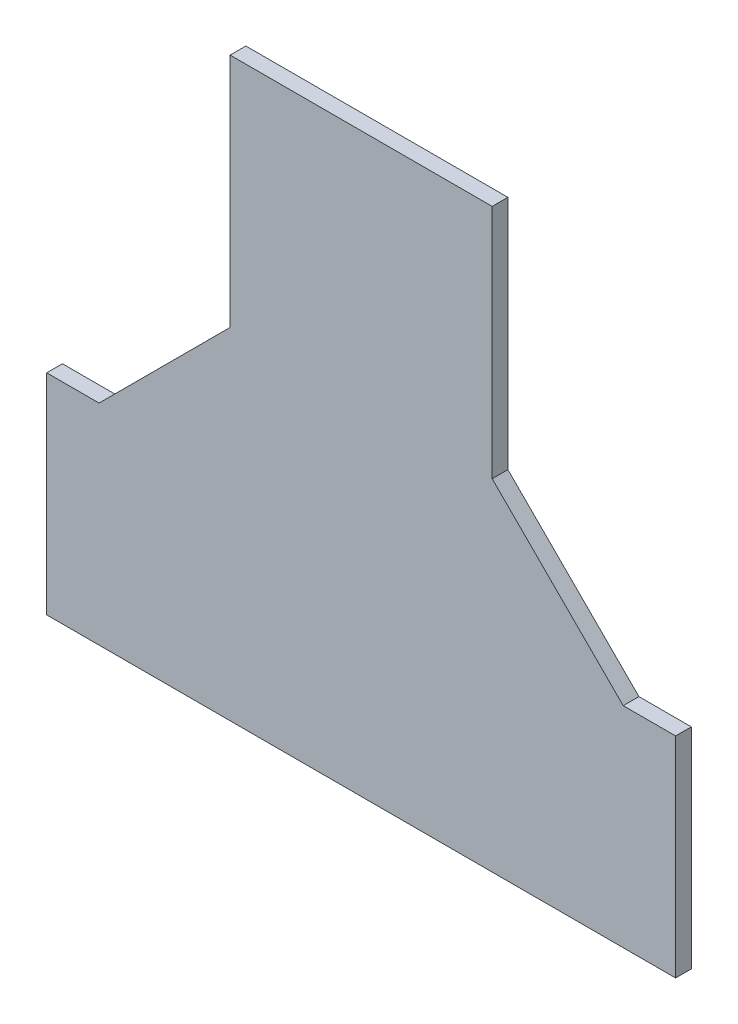
ISO-10303-21;
HEADER;
FILE_DESCRIPTION(('STEP AP214'),'2;1');
FILE_NAME('part.step','',(''),(''),'','','');
FILE_SCHEMA(('AUTOMOTIVE_DESIGN { 1 0 10303 214 1 1 1 1 }'));
ENDSEC;
DATA;
#1=APPLICATION_CONTEXT('core data for automotive mechanical design processes');
#2=APPLICATION_PROTOCOL_DEFINITION('international standard','automotive_design',2000,#1);
#3=PRODUCT_CONTEXT('',#1,'mechanical');
#4=PRODUCT('Part','Part','',(#3));
#5=PRODUCT_RELATED_PRODUCT_CATEGORY('part','',(#4));
#6=PRODUCT_DEFINITION_FORMATION('','',#4);
#7=PRODUCT_DEFINITION_CONTEXT('part definition',#1,'design');
#8=PRODUCT_DEFINITION('design','',#6,#7);
#9=PRODUCT_DEFINITION_SHAPE('','',#8);
#10=(LENGTH_UNIT() NAMED_UNIT(*) SI_UNIT(.MILLI.,.METRE.));
#11=(NAMED_UNIT(*) PLANE_ANGLE_UNIT() SI_UNIT($,.RADIAN.));
#12=(NAMED_UNIT(*) SI_UNIT($,.STERADIAN.) SOLID_ANGLE_UNIT());
#13=UNCERTAINTY_MEASURE_WITH_UNIT(LENGTH_MEASURE(1.E-05),#10,'distance_accuracy_value','');
#14=(GEOMETRIC_REPRESENTATION_CONTEXT(3) GLOBAL_UNCERTAINTY_ASSIGNED_CONTEXT((#13)) GLOBAL_UNIT_ASSIGNED_CONTEXT((#10,
#11,#12)) REPRESENTATION_CONTEXT('',''));
#15=CARTESIAN_POINT('',(0.,0.,0.));
#16=DIRECTION('',(0.,0.,1.));
#17=DIRECTION('',(1.,0.,0.));
#18=AXIS2_PLACEMENT_3D('',#15,#16,#17);
#19=CARTESIAN_POINT('',(120.,0.,3.));
#20=DIRECTION('',(0.,1.,0.));
#21=DIRECTION('',(-1.,0.,0.));
#22=AXIS2_PLACEMENT_3D('',#19,#20,#21);
#23=PLANE('',#22);
#24=DIRECTION('',(1.,0.,0.));
#25=VECTOR('',#24,1.);
#26=CARTESIAN_POINT('',(120.,0.,0.));
#27=LINE('',#26,#25);
#28=CARTESIAN_POINT('',(0.,0.,0.));
#29=VERTEX_POINT('',#28);
#30=CARTESIAN_POINT('',(120.,0.,0.));
#31=VERTEX_POINT('',#30);
#32=EDGE_CURVE('E143',#29,#31,#27,.T.);
#33=ORIENTED_EDGE('',*,*,#32,.T.);
#34=DIRECTION('',(0.,0.,-1.));
#35=VECTOR('',#34,1.);
#36=CARTESIAN_POINT('',(120.,0.,3.));
#37=LINE('',#36,#35);
#38=CARTESIAN_POINT('',(120.,0.,3.));
#39=VERTEX_POINT('',#38);
#40=EDGE_CURVE('E11',#39,#31,#37,.T.);
#41=ORIENTED_EDGE('',*,*,#40,.F.);
#42=DIRECTION('',(1.,0.,0.));
#43=VECTOR('',#42,1.);
#44=CARTESIAN_POINT('',(120.,0.,3.));
#45=LINE('',#44,#43);
#46=CARTESIAN_POINT('',(0.,0.,3.));
#47=VERTEX_POINT('',#46);
#48=EDGE_CURVE('E161',#47,#39,#45,.T.);
#49=ORIENTED_EDGE('',*,*,#48,.F.);
#50=DIRECTION('',(0.,0.,-1.));
#51=VECTOR('',#50,1.);
#52=CARTESIAN_POINT('',(0.,0.,3.));
#53=LINE('',#52,#51);
#54=EDGE_CURVE('E139',#47,#29,#53,.T.);
#55=ORIENTED_EDGE('',*,*,#54,.T.);
#56=EDGE_LOOP('',(#33,#41,#49,#55));
#57=FACE_BOUND('',#56,.T.);
#58=ADVANCED_FACE('F35',(#57),#23,.F.);
#59=CARTESIAN_POINT('',(120.,40.,3.));
#60=DIRECTION('',(-1.,0.,0.));
#61=DIRECTION('',(0.,0.,1.));
#62=AXIS2_PLACEMENT_3D('',#59,#60,#61);
#63=PLANE('',#62);
#64=DIRECTION('',(0.,1.,0.));
#65=VECTOR('',#64,1.);
#66=CARTESIAN_POINT('',(120.,40.,0.));
#67=LINE('',#66,#65);
#68=CARTESIAN_POINT('',(120.,40.,0.));
#69=VERTEX_POINT('',#68);
#70=EDGE_CURVE('E146',#31,#69,#67,.T.);
#71=ORIENTED_EDGE('',*,*,#70,.T.);
#72=DIRECTION('',(0.,0.,-1.));
#73=VECTOR('',#72,1.);
#74=CARTESIAN_POINT('',(120.,40.,3.));
#75=LINE('',#74,#73);
#76=CARTESIAN_POINT('',(120.,40.,3.));
#77=VERTEX_POINT('',#76);
#78=EDGE_CURVE('E43',#77,#69,#75,.T.);
#79=ORIENTED_EDGE('',*,*,#78,.F.);
#80=DIRECTION('',(0.,1.,0.));
#81=VECTOR('',#80,1.);
#82=CARTESIAN_POINT('',(120.,40.,3.));
#83=LINE('',#82,#81);
#84=EDGE_CURVE('E100',#39,#77,#83,.T.);
#85=ORIENTED_EDGE('',*,*,#84,.F.);
#86=ORIENTED_EDGE('',*,*,#40,.T.);
#87=EDGE_LOOP('',(#71,#79,#85,#86));
#88=FACE_BOUND('',#87,.T.);
#89=ADVANCED_FACE('F210',(#88),#63,.F.);
#90=CARTESIAN_POINT('',(110.,40.,3.));
#91=DIRECTION('',(0.,-1.,0.));
#92=DIRECTION('',(1.,0.,0.));
#93=AXIS2_PLACEMENT_3D('',#90,#91,#92);
#94=PLANE('',#93);
#95=DIRECTION('',(-1.,0.,0.));
#96=VECTOR('',#95,1.);
#97=CARTESIAN_POINT('',(110.,40.,0.));
#98=LINE('',#97,#96);
#99=CARTESIAN_POINT('',(110.,40.,0.));
#100=VERTEX_POINT('',#99);
#101=EDGE_CURVE('E148',#69,#100,#98,.T.);
#102=ORIENTED_EDGE('',*,*,#101,.T.);
#103=DIRECTION('',(0.,0.,-1.));
#104=VECTOR('',#103,1.);
#105=CARTESIAN_POINT('',(110.,40.,3.));
#106=LINE('',#105,#104);
#107=CARTESIAN_POINT('',(110.,40.,3.));
#108=VERTEX_POINT('',#107);
#109=EDGE_CURVE('E174',#108,#100,#106,.T.);
#110=ORIENTED_EDGE('',*,*,#109,.F.);
#111=DIRECTION('',(-1.,0.,0.));
#112=VECTOR('',#111,1.);
#113=CARTESIAN_POINT('',(110.,40.,3.));
#114=LINE('',#113,#112);
#115=EDGE_CURVE('E182',#77,#108,#114,.T.);
#116=ORIENTED_EDGE('',*,*,#115,.F.);
#117=ORIENTED_EDGE('',*,*,#78,.T.);
#118=EDGE_LOOP('',(#102,#110,#116,#117));
#119=FACE_BOUND('',#118,.T.);
#120=ADVANCED_FACE('F180',(#119),#94,.F.);
#121=CARTESIAN_POINT('',(85.,65.0000000000001,3.));
#122=DIRECTION('',(-0.707106781186549,-0.707106781186546,0.));
#123=DIRECTION('',(0.707106781186546,-0.707106781186549,0.));
#124=AXIS2_PLACEMENT_3D('',#121,#122,#123);
#125=PLANE('',#124);
#126=DIRECTION('',(-0.707106781186546,0.707106781186549,0.));
#127=VECTOR('',#126,1.);
#128=CARTESIAN_POINT('',(85.,65.0000000000001,0.));
#129=LINE('',#128,#127);
#130=CARTESIAN_POINT('',(85.,65.0000000000001,0.));
#131=VERTEX_POINT('',#130);
#132=EDGE_CURVE('E150',#100,#131,#129,.T.);
#133=ORIENTED_EDGE('',*,*,#132,.T.);
#134=DIRECTION('',(0.,0.,-1.));
#135=VECTOR('',#134,1.);
#136=CARTESIAN_POINT('',(85.,65.0000000000001,3.));
#137=LINE('',#136,#135);
#138=CARTESIAN_POINT('',(85.,65.0000000000001,3.));
#139=VERTEX_POINT('',#138);
#140=EDGE_CURVE('E171',#139,#131,#137,.T.);
#141=ORIENTED_EDGE('',*,*,#140,.F.);
#142=DIRECTION('',(-0.707106781186546,0.707106781186549,0.));
#143=VECTOR('',#142,1.);
#144=CARTESIAN_POINT('',(85.,65.0000000000001,3.));
#145=LINE('',#144,#143);
#146=EDGE_CURVE('E200',#108,#139,#145,.T.);
#147=ORIENTED_EDGE('',*,*,#146,.F.);
#148=ORIENTED_EDGE('',*,*,#109,.T.);
#149=EDGE_LOOP('',(#133,#141,#147,#148));
#150=FACE_BOUND('',#149,.T.);
#151=ADVANCED_FACE('F191',(#150),#125,.F.);
#152=CARTESIAN_POINT('',(85.,110.,3.));
#153=DIRECTION('',(-1.,0.,0.));
#154=DIRECTION('',(0.,0.,1.));
#155=AXIS2_PLACEMENT_3D('',#152,#153,#154);
#156=PLANE('',#155);
#157=DIRECTION('',(0.,1.,0.));
#158=VECTOR('',#157,1.);
#159=CARTESIAN_POINT('',(85.,110.,0.));
#160=LINE('',#159,#158);
#161=CARTESIAN_POINT('',(85.,110.,0.));
#162=VERTEX_POINT('',#161);
#163=EDGE_CURVE('E152',#131,#162,#160,.T.);
#164=ORIENTED_EDGE('',*,*,#163,.T.);
#165=DIRECTION('',(0.,0.,-1.));
#166=VECTOR('',#165,1.);
#167=CARTESIAN_POINT('',(85.,110.,3.));
#168=LINE('',#167,#166);
#169=CARTESIAN_POINT('',(85.,110.,3.));
#170=VERTEX_POINT('',#169);
#171=EDGE_CURVE('E168',#170,#162,#168,.T.);
#172=ORIENTED_EDGE('',*,*,#171,.F.);
#173=DIRECTION('',(0.,1.,0.));
#174=VECTOR('',#173,1.);
#175=CARTESIAN_POINT('',(85.,110.,3.));
#176=LINE('',#175,#174);
#177=EDGE_CURVE('E197',#139,#170,#176,.T.);
#178=ORIENTED_EDGE('',*,*,#177,.F.);
#179=ORIENTED_EDGE('',*,*,#140,.T.);
#180=EDGE_LOOP('',(#164,#172,#178,#179));
#181=FACE_BOUND('',#180,.T.);
#182=ADVANCED_FACE('F195',(#181),#156,.F.);
#183=CARTESIAN_POINT('',(35.,110.,3.));
#184=DIRECTION('',(0.,-1.,0.));
#185=DIRECTION('',(0.,0.,-1.));
#186=AXIS2_PLACEMENT_3D('',#183,#184,#185);
#187=PLANE('',#186);
#188=DIRECTION('',(-1.,0.,0.));
#189=VECTOR('',#188,1.);
#190=CARTESIAN_POINT('',(35.,110.,0.));
#191=LINE('',#190,#189);
#192=CARTESIAN_POINT('',(35.,110.,0.));
#193=VERTEX_POINT('',#192);
#194=EDGE_CURVE('E154',#162,#193,#191,.T.);
#195=ORIENTED_EDGE('',*,*,#194,.T.);
#196=DIRECTION('',(0.,0.,-1.));
#197=VECTOR('',#196,1.);
#198=CARTESIAN_POINT('',(35.,110.,3.));
#199=LINE('',#198,#197);
#200=CARTESIAN_POINT('',(35.,110.,3.));
#201=VERTEX_POINT('',#200);
#202=EDGE_CURVE('E165',#201,#193,#199,.T.);
#203=ORIENTED_EDGE('',*,*,#202,.F.);
#204=DIRECTION('',(-1.,0.,0.));
#205=VECTOR('',#204,1.);
#206=CARTESIAN_POINT('',(35.,110.,3.));
#207=LINE('',#206,#205);
#208=EDGE_CURVE('E199',#170,#201,#207,.T.);
#209=ORIENTED_EDGE('',*,*,#208,.F.);
#210=ORIENTED_EDGE('',*,*,#171,.T.);
#211=EDGE_LOOP('',(#195,#203,#209,#210));
#212=FACE_BOUND('',#211,.T.);
#213=ADVANCED_FACE('F222',(#212),#187,.F.);
#214=CARTESIAN_POINT('',(35.,65.0000000000001,3.));
#215=DIRECTION('',(1.,0.,0.));
#216=DIRECTION('',(0.,0.,-1.));
#217=AXIS2_PLACEMENT_3D('',#214,#215,#216);
#218=PLANE('',#217);
#219=DIRECTION('',(0.,-1.,0.));
#220=VECTOR('',#219,1.);
#221=CARTESIAN_POINT('',(35.,65.0000000000001,0.));
#222=LINE('',#221,#220);
#223=CARTESIAN_POINT('',(35.,65.0000000000001,0.));
#224=VERTEX_POINT('',#223);
#225=EDGE_CURVE('E156',#193,#224,#222,.T.);
#226=ORIENTED_EDGE('',*,*,#225,.T.);
#227=DIRECTION('',(0.,0.,-1.));
#228=VECTOR('',#227,1.);
#229=CARTESIAN_POINT('',(35.,65.0000000000001,3.));
#230=LINE('',#229,#228);
#231=CARTESIAN_POINT('',(35.,65.0000000000001,3.));
#232=VERTEX_POINT('',#231);
#233=EDGE_CURVE('E134',#232,#224,#230,.T.);
#234=ORIENTED_EDGE('',*,*,#233,.F.);
#235=DIRECTION('',(0.,-1.,0.));
#236=VECTOR('',#235,1.);
#237=CARTESIAN_POINT('',(35.,65.0000000000001,3.));
#238=LINE('',#237,#236);
#239=EDGE_CURVE('E125',#201,#232,#238,.T.);
#240=ORIENTED_EDGE('',*,*,#239,.F.);
#241=ORIENTED_EDGE('',*,*,#202,.T.);
#242=EDGE_LOOP('',(#226,#234,#240,#241));
#243=FACE_BOUND('',#242,.T.);
#244=ADVANCED_FACE('F225',(#243),#218,.F.);
#245=CARTESIAN_POINT('',(10.,40.,3.));
#246=DIRECTION('',(0.707106781186549,-0.707106781186546,0.));
#247=DIRECTION('',(0.707106781186546,0.707106781186549,0.));
#248=AXIS2_PLACEMENT_3D('',#245,#246,#247);
#249=PLANE('',#248);
#250=DIRECTION('',(-0.707106781186546,-0.707106781186549,0.));
#251=VECTOR('',#250,1.);
#252=CARTESIAN_POINT('',(10.,40.,0.));
#253=LINE('',#252,#251);
#254=CARTESIAN_POINT('',(10.,40.,0.));
#255=VERTEX_POINT('',#254);
#256=EDGE_CURVE('E133',#224,#255,#253,.T.);
#257=ORIENTED_EDGE('',*,*,#256,.T.);
#258=DIRECTION('',(0.,0.,-1.));
#259=VECTOR('',#258,1.);
#260=CARTESIAN_POINT('',(10.,40.,3.));
#261=LINE('',#260,#259);
#262=CARTESIAN_POINT('',(10.,40.,3.));
#263=VERTEX_POINT('',#262);
#264=EDGE_CURVE('E130',#263,#255,#261,.T.);
#265=ORIENTED_EDGE('',*,*,#264,.F.);
#266=DIRECTION('',(-0.707106781186546,-0.707106781186549,0.));
#267=VECTOR('',#266,1.);
#268=CARTESIAN_POINT('',(10.,40.,3.));
#269=LINE('',#268,#267);
#270=EDGE_CURVE('E119',#232,#263,#269,.T.);
#271=ORIENTED_EDGE('',*,*,#270,.F.);
#272=ORIENTED_EDGE('',*,*,#233,.T.);
#273=EDGE_LOOP('',(#257,#265,#271,#272));
#274=FACE_BOUND('',#273,.T.);
#275=ADVANCED_FACE('F131',(#274),#249,.F.);
#276=CARTESIAN_POINT('',(0.,40.,3.));
#277=DIRECTION('',(0.,-1.,0.));
#278=DIRECTION('',(0.,0.,-1.));
#279=AXIS2_PLACEMENT_3D('',#276,#277,#278);
#280=PLANE('',#279);
#281=DIRECTION('',(-1.,0.,0.));
#282=VECTOR('',#281,1.);
#283=CARTESIAN_POINT('',(0.,40.,0.));
#284=LINE('',#283,#282);
#285=CARTESIAN_POINT('',(0.,40.,0.));
#286=VERTEX_POINT('',#285);
#287=EDGE_CURVE('E86',#255,#286,#284,.T.);
#288=ORIENTED_EDGE('',*,*,#287,.T.);
#289=DIRECTION('',(0.,0.,-1.));
#290=VECTOR('',#289,1.);
#291=CARTESIAN_POINT('',(0.,40.,3.));
#292=LINE('',#291,#290);
#293=CARTESIAN_POINT('',(0.,40.,3.));
#294=VERTEX_POINT('',#293);
#295=EDGE_CURVE('E135',#294,#286,#292,.T.);
#296=ORIENTED_EDGE('',*,*,#295,.F.);
#297=DIRECTION('',(-1.,0.,0.));
#298=VECTOR('',#297,1.);
#299=CARTESIAN_POINT('',(0.,40.,3.));
#300=LINE('',#299,#298);
#301=EDGE_CURVE('E123',#263,#294,#300,.T.);
#302=ORIENTED_EDGE('',*,*,#301,.F.);
#303=ORIENTED_EDGE('',*,*,#264,.T.);
#304=EDGE_LOOP('',(#288,#296,#302,#303));
#305=FACE_BOUND('',#304,.T.);
#306=ADVANCED_FACE('F137',(#305),#280,.F.);
#307=CARTESIAN_POINT('',(0.,0.,3.));
#308=DIRECTION('',(1.,0.,0.));
#309=DIRECTION('',(0.,0.,-1.));
#310=AXIS2_PLACEMENT_3D('',#307,#308,#309);
#311=PLANE('',#310);
#312=DIRECTION('',(0.,-1.,0.));
#313=VECTOR('',#312,1.);
#314=CARTESIAN_POINT('',(0.,0.,0.));
#315=LINE('',#314,#313);
#316=EDGE_CURVE('E92',#286,#29,#315,.T.);
#317=ORIENTED_EDGE('',*,*,#316,.T.);
#318=ORIENTED_EDGE('',*,*,#54,.F.);
#319=DIRECTION('',(0.,-1.,0.));
#320=VECTOR('',#319,1.);
#321=CARTESIAN_POINT('',(0.,0.,3.));
#322=LINE('',#321,#320);
#323=EDGE_CURVE('E51',#294,#47,#322,.T.);
#324=ORIENTED_EDGE('',*,*,#323,.F.);
#325=ORIENTED_EDGE('',*,*,#295,.T.);
#326=EDGE_LOOP('',(#317,#318,#324,#325));
#327=FACE_BOUND('',#326,.T.);
#328=ADVANCED_FACE('F234',(#327),#311,.F.);
#329=CARTESIAN_POINT('',(0.,0.,3.));
#330=DIRECTION('',(0.,0.,-1.));
#331=DIRECTION('',(-1.,0.,0.));
#332=AXIS2_PLACEMENT_3D('',#329,#330,#331);
#333=PLANE('',#332);
#334=ORIENTED_EDGE('',*,*,#48,.T.);
#335=ORIENTED_EDGE('',*,*,#84,.T.);
#336=ORIENTED_EDGE('',*,*,#115,.T.);
#337=ORIENTED_EDGE('',*,*,#146,.T.);
#338=ORIENTED_EDGE('',*,*,#177,.T.);
#339=ORIENTED_EDGE('',*,*,#208,.T.);
#340=ORIENTED_EDGE('',*,*,#239,.T.);
#341=ORIENTED_EDGE('',*,*,#270,.T.);
#342=ORIENTED_EDGE('',*,*,#301,.T.);
#343=ORIENTED_EDGE('',*,*,#323,.T.);
#344=EDGE_LOOP('',(#334,#335,#336,#337,#338,#339,#340,#341,#342,#343));
#345=FACE_BOUND('',#344,.T.);
#346=ADVANCED_FACE('F121',(#345),#333,.F.);
#347=CARTESIAN_POINT('',(0.,0.,0.));
#348=DIRECTION('',(0.,0.,-1.));
#349=DIRECTION('',(-1.,0.,0.));
#350=AXIS2_PLACEMENT_3D('',#347,#348,#349);
#351=PLANE('',#350);
#352=ORIENTED_EDGE('',*,*,#32,.F.);
#353=ORIENTED_EDGE('',*,*,#316,.F.);
#354=ORIENTED_EDGE('',*,*,#287,.F.);
#355=ORIENTED_EDGE('',*,*,#256,.F.);
#356=ORIENTED_EDGE('',*,*,#225,.F.);
#357=ORIENTED_EDGE('',*,*,#194,.F.);
#358=ORIENTED_EDGE('',*,*,#163,.F.);
#359=ORIENTED_EDGE('',*,*,#132,.F.);
#360=ORIENTED_EDGE('',*,*,#101,.F.);
#361=ORIENTED_EDGE('',*,*,#70,.F.);
#362=EDGE_LOOP('',(#352,#353,#354,#355,#356,#357,#358,#359,#360,#361));
#363=FACE_BOUND('',#362,.T.);
#364=ADVANCED_FACE('F186',(#363),#351,.T.);
#365=CLOSED_SHELL('',(#58,#89,#120,#151,#182,#213,#244,#275,#306,#328,#346,#364));
#366=MANIFOLD_SOLID_BREP('B2',#365);
#367=ADVANCED_BREP_SHAPE_REPRESENTATION('',(#18,#366),#14);
#368=SHAPE_DEFINITION_REPRESENTATION(#9,#367);
ENDSEC;
END-ISO-10303-21;
